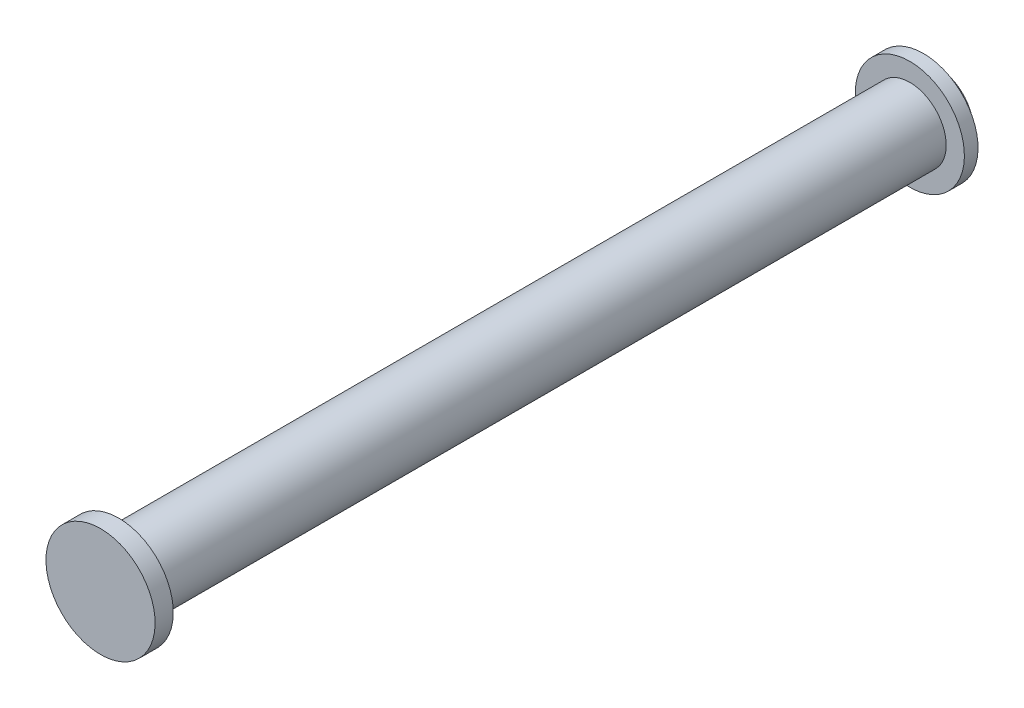
ISO-10303-21;
HEADER;
FILE_DESCRIPTION(('STEP AP214'),'2;1');
FILE_NAME('part.step','',(''),(''),'','','');
FILE_SCHEMA(('AUTOMOTIVE_DESIGN { 1 0 10303 214 1 1 1 1 }'));
ENDSEC;
DATA;
#1=APPLICATION_CONTEXT('core data for automotive mechanical design processes');
#2=APPLICATION_PROTOCOL_DEFINITION('international standard','automotive_design',2000,#1);
#3=PRODUCT_CONTEXT('',#1,'mechanical');
#4=PRODUCT('Part','Part','',(#3));
#5=PRODUCT_RELATED_PRODUCT_CATEGORY('part','',(#4));
#6=PRODUCT_DEFINITION_FORMATION('','',#4);
#7=PRODUCT_DEFINITION_CONTEXT('part definition',#1,'design');
#8=PRODUCT_DEFINITION('design','',#6,#7);
#9=PRODUCT_DEFINITION_SHAPE('','',#8);
#10=(LENGTH_UNIT() NAMED_UNIT(*) SI_UNIT(.MILLI.,.METRE.));
#11=(NAMED_UNIT(*) PLANE_ANGLE_UNIT() SI_UNIT($,.RADIAN.));
#12=(NAMED_UNIT(*) SI_UNIT($,.STERADIAN.) SOLID_ANGLE_UNIT());
#13=UNCERTAINTY_MEASURE_WITH_UNIT(LENGTH_MEASURE(1.E-05),#10,'distance_accuracy_value','');
#14=(GEOMETRIC_REPRESENTATION_CONTEXT(3) GLOBAL_UNCERTAINTY_ASSIGNED_CONTEXT((#13)) GLOBAL_UNIT_ASSIGNED_CONTEXT((#10,
#11,#12)) REPRESENTATION_CONTEXT('',''));
#15=CARTESIAN_POINT('',(0.,0.,0.));
#16=DIRECTION('',(0.,0.,1.));
#17=DIRECTION('',(1.,0.,0.));
#18=AXIS2_PLACEMENT_3D('',#15,#16,#17);
#19=CARTESIAN_POINT('',(0.,0.,0.));
#20=DIRECTION('',(0.,0.,1.));
#21=DIRECTION('',(0.,-1.,0.));
#22=AXIS2_PLACEMENT_3D('',#19,#20,#21);
#23=PLANE('',#22);
#24=CARTESIAN_POINT('',(0.,0.,0.));
#25=DIRECTION('',(0.,0.,-1.));
#26=DIRECTION('',(0.,1.,0.));
#27=AXIS2_PLACEMENT_3D('',#24,#25,#26);
#28=CIRCLE('',#27,5.99999999999999);
#29=CARTESIAN_POINT('',(0.,5.99999999999999,0.));
#30=VERTEX_POINT('',#29);
#31=EDGE_CURVE('E12',#30,#30,#28,.T.);
#32=ORIENTED_EDGE('',*,*,#31,.F.);
#33=EDGE_LOOP('',(#32));
#34=FACE_BOUND('',#33,.T.);
#35=ADVANCED_FACE('F44',(#34),#23,.T.);
#36=CARTESIAN_POINT('',(0.,0.,-92.));
#37=DIRECTION('',(0.,0.,-1.));
#38=DIRECTION('',(0.,1.,0.));
#39=AXIS2_PLACEMENT_3D('',#36,#37,#38);
#40=CYLINDRICAL_SURFACE('',#39,5.99999999999999);
#41=ORIENTED_EDGE('',*,*,#31,.T.);
#42=EDGE_LOOP('',(#41));
#43=FACE_BOUND('',#42,.T.);
#44=CARTESIAN_POINT('',(0.,0.,-2.));
#45=DIRECTION('',(0.,0.,-1.));
#46=DIRECTION('',(0.,1.,0.));
#47=AXIS2_PLACEMENT_3D('',#44,#45,#46);
#48=CIRCLE('',#47,5.99999999999999);
#49=CARTESIAN_POINT('',(0.,5.99999999999999,-2.));
#50=VERTEX_POINT('',#49);
#51=EDGE_CURVE('E50',#50,#50,#48,.T.);
#52=ORIENTED_EDGE('',*,*,#51,.F.);
#53=EDGE_LOOP('',(#52));
#54=FACE_BOUND('',#53,.T.);
#55=ADVANCED_FACE('F92',(#43,#54),#40,.T.);
#56=CARTESIAN_POINT('',(0.,5.99999999999999,-2.));
#57=DIRECTION('',(0.,0.,-1.));
#58=DIRECTION('',(0.,1.,0.));
#59=AXIS2_PLACEMENT_3D('',#56,#57,#58);
#60=PLANE('',#59);
#61=ORIENTED_EDGE('',*,*,#51,.T.);
#62=EDGE_LOOP('',(#61));
#63=FACE_BOUND('',#62,.T.);
#64=CARTESIAN_POINT('',(0.,0.,-2.));
#65=DIRECTION('',(0.,0.,-1.));
#66=DIRECTION('',(0.,1.,0.));
#67=AXIS2_PLACEMENT_3D('',#64,#65,#66);
#68=CIRCLE('',#67,3.99999999999999);
#69=CARTESIAN_POINT('',(0.,3.99999999999999,-2.));
#70=VERTEX_POINT('',#69);
#71=EDGE_CURVE('E54',#70,#70,#68,.T.);
#72=ORIENTED_EDGE('',*,*,#71,.F.);
#73=EDGE_LOOP('',(#72));
#74=FACE_BOUND('',#73,.T.);
#75=ADVANCED_FACE('F97',(#63,#74),#60,.T.);
#76=CARTESIAN_POINT('',(0.,0.,-92.));
#77=DIRECTION('',(0.,0.,-1.));
#78=DIRECTION('',(0.,1.,0.));
#79=AXIS2_PLACEMENT_3D('',#76,#77,#78);
#80=CYLINDRICAL_SURFACE('',#79,3.99999999999998);
#81=ORIENTED_EDGE('',*,*,#71,.T.);
#82=EDGE_LOOP('',(#81));
#83=FACE_BOUND('',#82,.T.);
#84=CARTESIAN_POINT('',(0.,0.,-89.));
#85=DIRECTION('',(0.,0.,-1.));
#86=DIRECTION('',(0.,1.,0.));
#87=AXIS2_PLACEMENT_3D('',#84,#85,#86);
#88=CIRCLE('',#87,3.99999999999998);
#89=CARTESIAN_POINT('',(0.,3.99999999999999,-89.));
#90=VERTEX_POINT('',#89);
#91=EDGE_CURVE('E58',#90,#90,#88,.T.);
#92=ORIENTED_EDGE('',*,*,#91,.F.);
#93=EDGE_LOOP('',(#92));
#94=FACE_BOUND('',#93,.T.);
#95=ADVANCED_FACE('F101',(#83,#94),#80,.T.);
#96=CARTESIAN_POINT('',(0.,3.99999999999999,-89.));
#97=DIRECTION('',(0.,0.,1.));
#98=DIRECTION('',(0.,-1.,0.));
#99=AXIS2_PLACEMENT_3D('',#96,#97,#98);
#100=PLANE('',#99);
#101=ORIENTED_EDGE('',*,*,#91,.T.);
#102=EDGE_LOOP('',(#101));
#103=FACE_BOUND('',#102,.T.);
#104=CARTESIAN_POINT('',(0.,0.,-89.));
#105=DIRECTION('',(0.,0.,-1.));
#106=DIRECTION('',(0.,1.,0.));
#107=AXIS2_PLACEMENT_3D('',#104,#105,#106);
#108=CIRCLE('',#107,5.99999999999998);
#109=CARTESIAN_POINT('',(0.,5.99999999999999,-89.));
#110=VERTEX_POINT('',#109);
#111=EDGE_CURVE('E63',#110,#110,#108,.T.);
#112=ORIENTED_EDGE('',*,*,#111,.F.);
#113=EDGE_LOOP('',(#112));
#114=FACE_BOUND('',#113,.T.);
#115=ADVANCED_FACE('F107',(#103,#114),#100,.T.);
#116=CARTESIAN_POINT('',(0.,0.,-92.));
#117=DIRECTION('',(0.,0.,-1.));
#118=DIRECTION('',(0.,1.,0.));
#119=AXIS2_PLACEMENT_3D('',#116,#117,#118);
#120=CYLINDRICAL_SURFACE('',#119,5.99999999999998);
#121=ORIENTED_EDGE('',*,*,#111,.T.);
#122=EDGE_LOOP('',(#121));
#123=FACE_BOUND('',#122,.T.);
#124=CARTESIAN_POINT('',(0.,0.,-90.5));
#125=DIRECTION('',(0.,0.,-1.));
#126=DIRECTION('',(0.,1.,0.));
#127=AXIS2_PLACEMENT_3D('',#124,#125,#126);
#128=CIRCLE('',#127,5.99999999999998);
#129=CARTESIAN_POINT('',(0.,5.99999999999999,-90.5));
#130=VERTEX_POINT('',#129);
#131=EDGE_CURVE('E66',#130,#130,#128,.T.);
#132=ORIENTED_EDGE('',*,*,#131,.F.);
#133=EDGE_LOOP('',(#132));
#134=FACE_BOUND('',#133,.T.);
#135=ADVANCED_FACE('F88',(#123,#134),#120,.T.);
#136=CARTESIAN_POINT('',(0.,5.99999999999999,-90.5));
#137=DIRECTION('',(0.,0.,-1.));
#138=DIRECTION('',(0.,1.,0.));
#139=AXIS2_PLACEMENT_3D('',#136,#137,#138);
#140=PLANE('',#139);
#141=ORIENTED_EDGE('',*,*,#131,.T.);
#142=EDGE_LOOP('',(#141));
#143=FACE_BOUND('',#142,.T.);
#144=CARTESIAN_POINT('',(0.,0.,-90.5));
#145=DIRECTION('',(0.,0.,-1.));
#146=DIRECTION('',(0.,1.,0.));
#147=AXIS2_PLACEMENT_3D('',#144,#145,#146);
#148=CIRCLE('',#147,3.99999999999998);
#149=CARTESIAN_POINT('',(0.,3.99999999999999,-90.5));
#150=VERTEX_POINT('',#149);
#151=EDGE_CURVE('E69',#150,#150,#148,.T.);
#152=ORIENTED_EDGE('',*,*,#151,.F.);
#153=EDGE_LOOP('',(#152));
#154=FACE_BOUND('',#153,.T.);
#155=ADVANCED_FACE('F80',(#143,#154),#140,.T.);
#156=CARTESIAN_POINT('',(0.,0.,-92.));
#157=DIRECTION('',(0.,0.,-1.));
#158=DIRECTION('',(0.,1.,0.));
#159=AXIS2_PLACEMENT_3D('',#156,#157,#158);
#160=CYLINDRICAL_SURFACE('',#159,3.99999999999998);
#161=ORIENTED_EDGE('',*,*,#151,.T.);
#162=EDGE_LOOP('',(#161));
#163=FACE_BOUND('',#162,.T.);
#164=CARTESIAN_POINT('',(0.,0.,-92.));
#165=DIRECTION('',(0.,0.,-1.));
#166=DIRECTION('',(0.,1.,0.));
#167=AXIS2_PLACEMENT_3D('',#164,#165,#166);
#168=CIRCLE('',#167,3.99999999999998);
#169=CARTESIAN_POINT('',(0.,3.99999999999999,-92.));
#170=VERTEX_POINT('',#169);
#171=EDGE_CURVE('E72',#170,#170,#168,.T.);
#172=ORIENTED_EDGE('',*,*,#171,.F.);
#173=EDGE_LOOP('',(#172));
#174=FACE_BOUND('',#173,.T.);
#175=ADVANCED_FACE('F78',(#163,#174),#160,.T.);
#176=CARTESIAN_POINT('',(0.,3.99999999999999,-92.));
#177=DIRECTION('',(0.,0.,-1.));
#178=DIRECTION('',(0.,1.,0.));
#179=AXIS2_PLACEMENT_3D('',#176,#177,#178);
#180=PLANE('',#179);
#181=ORIENTED_EDGE('',*,*,#171,.T.);
#182=EDGE_LOOP('',(#181));
#183=FACE_BOUND('',#182,.T.);
#184=ADVANCED_FACE('F76',(#183),#180,.T.);
#185=CLOSED_SHELL('',(#35,#55,#75,#95,#115,#135,#155,#175,#184));
#186=MANIFOLD_SOLID_BREP('B2',#185);
#187=ADVANCED_BREP_SHAPE_REPRESENTATION('',(#18,#186),#14);
#188=SHAPE_DEFINITION_REPRESENTATION(#9,#187);
ENDSEC;
END-ISO-10303-21;
